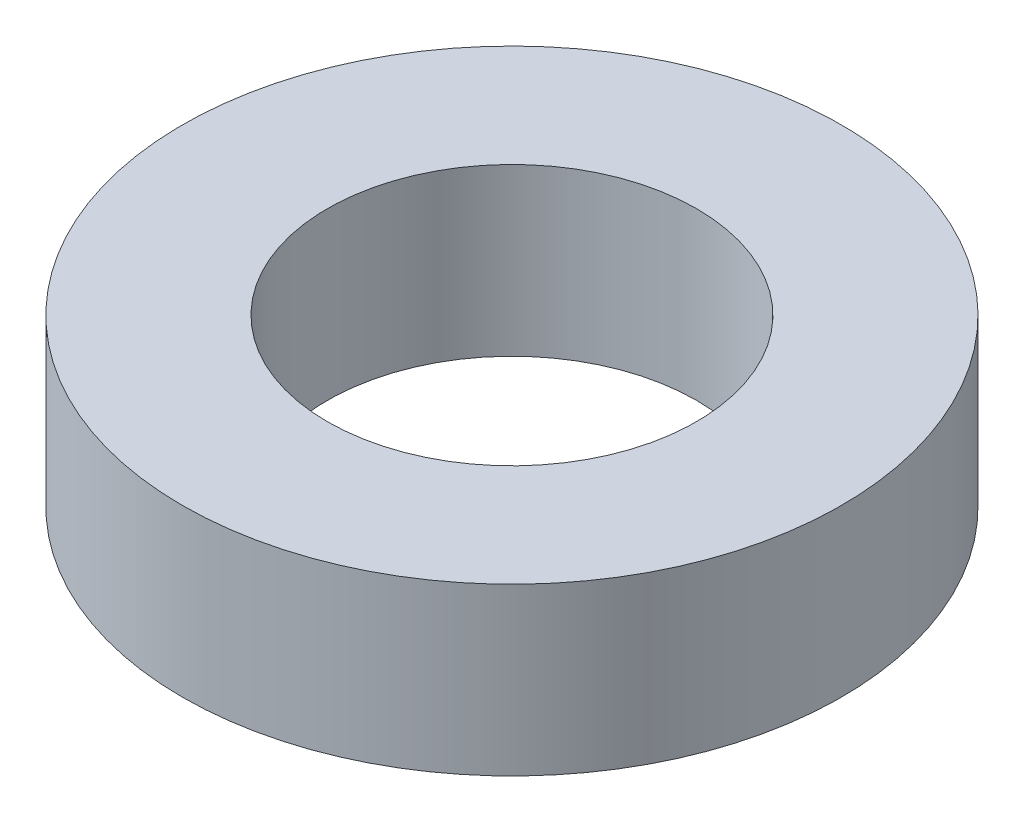
ISO-10303-21;
HEADER;
FILE_DESCRIPTION(('STEP AP214'),'2;1');
FILE_NAME('part.step','',(''),(''),'','','');
FILE_SCHEMA(('AUTOMOTIVE_DESIGN { 1 0 10303 214 1 1 1 1 }'));
ENDSEC;
DATA;
#1=APPLICATION_CONTEXT('core data for automotive mechanical design processes');
#2=APPLICATION_PROTOCOL_DEFINITION('international standard','automotive_design',2000,#1);
#3=PRODUCT_CONTEXT('',#1,'mechanical');
#4=PRODUCT('Part','Part','',(#3));
#5=PRODUCT_RELATED_PRODUCT_CATEGORY('part','',(#4));
#6=PRODUCT_DEFINITION_FORMATION('','',#4);
#7=PRODUCT_DEFINITION_CONTEXT('part definition',#1,'design');
#8=PRODUCT_DEFINITION('design','',#6,#7);
#9=PRODUCT_DEFINITION_SHAPE('','',#8);
#10=(LENGTH_UNIT() NAMED_UNIT(*) SI_UNIT(.MILLI.,.METRE.));
#11=(NAMED_UNIT(*) PLANE_ANGLE_UNIT() SI_UNIT($,.RADIAN.));
#12=(NAMED_UNIT(*) SI_UNIT($,.STERADIAN.) SOLID_ANGLE_UNIT());
#13=UNCERTAINTY_MEASURE_WITH_UNIT(LENGTH_MEASURE(1.E-05),#10,'distance_accuracy_value','');
#14=(GEOMETRIC_REPRESENTATION_CONTEXT(3) GLOBAL_UNCERTAINTY_ASSIGNED_CONTEXT((#13)) GLOBAL_UNIT_ASSIGNED_CONTEXT((#10,
#11,#12)) REPRESENTATION_CONTEXT('',''));
#15=CARTESIAN_POINT('',(0.,0.,0.));
#16=DIRECTION('',(0.,0.,1.));
#17=DIRECTION('',(1.,0.,0.));
#18=AXIS2_PLACEMENT_3D('',#15,#16,#17);
#19=CARTESIAN_POINT('',(0.,1.6,0.));
#20=DIRECTION('',(0.,1.,0.));
#21=DIRECTION('',(0.,0.,1.));
#22=AXIS2_PLACEMENT_3D('',#19,#20,#21);
#23=PLANE('',#22);
#24=CARTESIAN_POINT('',(0.,1.6,0.));
#25=DIRECTION('',(0.,1.,0.));
#26=DIRECTION('',(0.,0.,1.));
#27=AXIS2_PLACEMENT_3D('',#24,#25,#26);
#28=CIRCLE('',#27,3.175);
#29=CARTESIAN_POINT('',(0.,1.6,3.175));
#30=VERTEX_POINT('',#29);
#31=EDGE_CURVE('E10',#30,#30,#28,.T.);
#32=ORIENTED_EDGE('',*,*,#31,.T.);
#33=EDGE_LOOP('',(#32));
#34=FACE_BOUND('',#33,.T.);
#35=CARTESIAN_POINT('',(0.,1.6,0.));
#36=DIRECTION('',(0.,1.,0.));
#37=DIRECTION('',(0.,0.,1.));
#38=AXIS2_PLACEMENT_3D('',#35,#36,#37);
#39=CIRCLE('',#38,1.778);
#40=CARTESIAN_POINT('',(0.,1.6,1.778));
#41=VERTEX_POINT('',#40);
#42=EDGE_CURVE('E42',#41,#41,#39,.T.);
#43=ORIENTED_EDGE('',*,*,#42,.F.);
#44=EDGE_LOOP('',(#43));
#45=FACE_BOUND('',#44,.T.);
#46=ADVANCED_FACE('F31',(#34,#45),#23,.T.);
#47=CARTESIAN_POINT('',(0.,0.,0.));
#48=DIRECTION('',(0.,1.,0.));
#49=DIRECTION('',(0.,0.,1.));
#50=AXIS2_PLACEMENT_3D('',#47,#48,#49);
#51=PLANE('',#50);
#52=CARTESIAN_POINT('',(0.,0.,0.));
#53=DIRECTION('',(0.,1.,0.));
#54=DIRECTION('',(0.,0.,1.));
#55=AXIS2_PLACEMENT_3D('',#52,#53,#54);
#56=CIRCLE('',#55,3.175);
#57=CARTESIAN_POINT('',(0.,0.,3.175));
#58=VERTEX_POINT('',#57);
#59=EDGE_CURVE('E35',#58,#58,#56,.T.);
#60=ORIENTED_EDGE('',*,*,#59,.F.);
#61=EDGE_LOOP('',(#60));
#62=FACE_BOUND('',#61,.T.);
#63=CARTESIAN_POINT('',(0.,0.,0.));
#64=DIRECTION('',(0.,1.,0.));
#65=DIRECTION('',(0.,0.,1.));
#66=AXIS2_PLACEMENT_3D('',#63,#64,#65);
#67=CIRCLE('',#66,1.778);
#68=CARTESIAN_POINT('',(0.,0.,1.778));
#69=VERTEX_POINT('',#68);
#70=EDGE_CURVE('E44',#69,#69,#67,.T.);
#71=ORIENTED_EDGE('',*,*,#70,.T.);
#72=EDGE_LOOP('',(#71));
#73=FACE_BOUND('',#72,.T.);
#74=ADVANCED_FACE('F54',(#62,#73),#51,.F.);
#75=CARTESIAN_POINT('',(0.,1.6,0.));
#76=DIRECTION('',(0.,-1.,0.));
#77=DIRECTION('',(0.,0.,-1.));
#78=AXIS2_PLACEMENT_3D('',#75,#76,#77);
#79=CYLINDRICAL_SURFACE('',#78,3.175);
#80=ORIENTED_EDGE('',*,*,#31,.F.);
#81=EDGE_LOOP('',(#80));
#82=FACE_BOUND('',#81,.T.);
#83=ORIENTED_EDGE('',*,*,#59,.T.);
#84=EDGE_LOOP('',(#83));
#85=FACE_BOUND('',#84,.T.);
#86=ADVANCED_FACE('F33',(#82,#85),#79,.T.);
#87=CARTESIAN_POINT('',(0.,1.6,0.));
#88=DIRECTION('',(0.,-1.,0.));
#89=DIRECTION('',(0.,0.,-1.));
#90=AXIS2_PLACEMENT_3D('',#87,#88,#89);
#91=CYLINDRICAL_SURFACE('',#90,1.778);
#92=ORIENTED_EDGE('',*,*,#42,.T.);
#93=EDGE_LOOP('',(#92));
#94=FACE_BOUND('',#93,.T.);
#95=ORIENTED_EDGE('',*,*,#70,.F.);
#96=EDGE_LOOP('',(#95));
#97=FACE_BOUND('',#96,.T.);
#98=ADVANCED_FACE('F50',(#94,#97),#91,.F.);
#99=CLOSED_SHELL('',(#46,#74,#86,#98));
#100=MANIFOLD_SOLID_BREP('B2',#99);
#101=ADVANCED_BREP_SHAPE_REPRESENTATION('',(#18,#100),#14);
#102=SHAPE_DEFINITION_REPRESENTATION(#9,#101);
ENDSEC;
END-ISO-10303-21;
